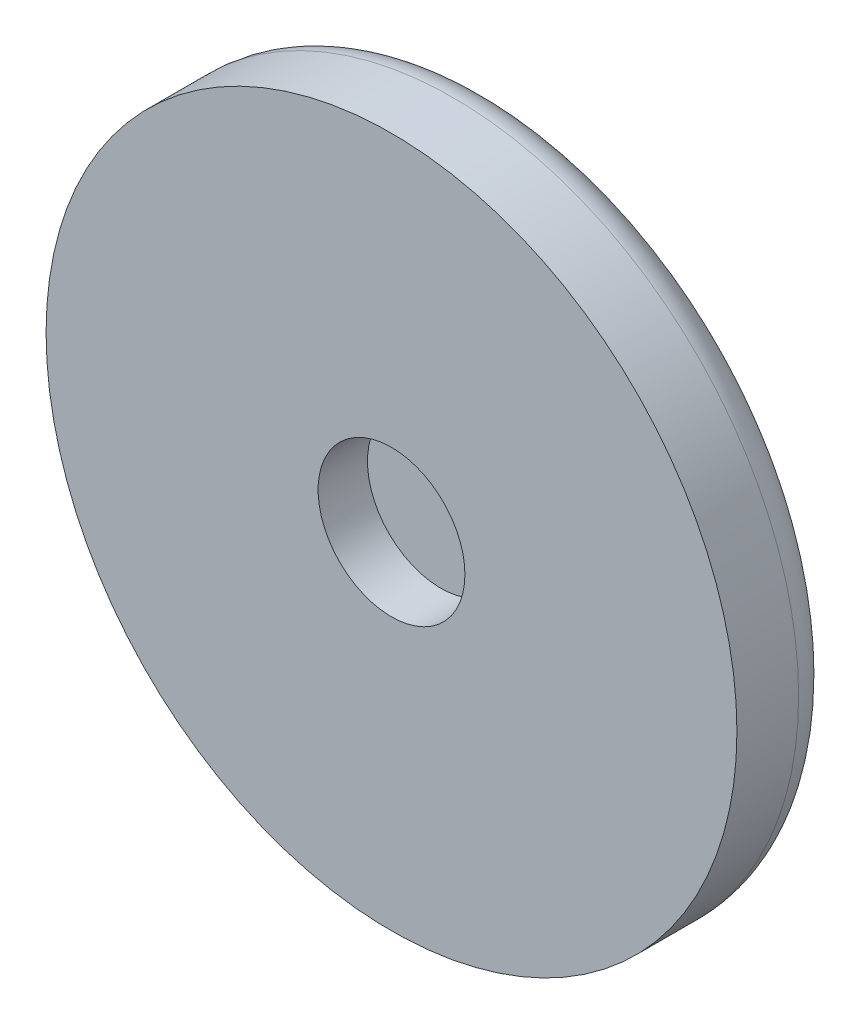
ISO-10303-21;
HEADER;
FILE_DESCRIPTION(('STEP AP214'),'2;1');
FILE_NAME('part.step','',(''),(''),'','','');
FILE_SCHEMA(('AUTOMOTIVE_DESIGN { 1 0 10303 214 1 1 1 1 }'));
ENDSEC;
DATA;
#1=APPLICATION_CONTEXT('core data for automotive mechanical design processes');
#2=APPLICATION_PROTOCOL_DEFINITION('international standard','automotive_design',2000,#1);
#3=PRODUCT_CONTEXT('',#1,'mechanical');
#4=PRODUCT('Part','Part','',(#3));
#5=PRODUCT_RELATED_PRODUCT_CATEGORY('part','',(#4));
#6=PRODUCT_DEFINITION_FORMATION('','',#4);
#7=PRODUCT_DEFINITION_CONTEXT('part definition',#1,'design');
#8=PRODUCT_DEFINITION('design','',#6,#7);
#9=PRODUCT_DEFINITION_SHAPE('','',#8);
#10=(LENGTH_UNIT() NAMED_UNIT(*) SI_UNIT(.MILLI.,.METRE.));
#11=(NAMED_UNIT(*) PLANE_ANGLE_UNIT() SI_UNIT($,.RADIAN.));
#12=(NAMED_UNIT(*) SI_UNIT($,.STERADIAN.) SOLID_ANGLE_UNIT());
#13=UNCERTAINTY_MEASURE_WITH_UNIT(LENGTH_MEASURE(1.E-05),#10,'distance_accuracy_value','');
#14=(GEOMETRIC_REPRESENTATION_CONTEXT(3) GLOBAL_UNCERTAINTY_ASSIGNED_CONTEXT((#13)) GLOBAL_UNIT_ASSIGNED_CONTEXT((#10,
#11,#12)) REPRESENTATION_CONTEXT('',''));
#15=CARTESIAN_POINT('',(0.,0.,0.));
#16=DIRECTION('',(0.,0.,1.));
#17=DIRECTION('',(1.,0.,0.));
#18=AXIS2_PLACEMENT_3D('',#15,#16,#17);
#19=CARTESIAN_POINT('',(0.,0.,4.));
#20=DIRECTION('',(0.,0.,-1.));
#21=DIRECTION('',(-1.,0.,0.));
#22=AXIS2_PLACEMENT_3D('',#19,#20,#21);
#23=CYLINDRICAL_SURFACE('',#22,14.);
#24=CARTESIAN_POINT('',(0.,0.,1.5));
#25=DIRECTION('',(0.,0.,1.));
#26=DIRECTION('',(1.,0.,0.));
#27=AXIS2_PLACEMENT_3D('',#24,#25,#26);
#28=CIRCLE('',#27,14.);
#29=CARTESIAN_POINT('',(14.,0.,1.5));
#30=VERTEX_POINT('',#29);
#31=EDGE_CURVE('E38',#30,#30,#28,.T.);
#32=ORIENTED_EDGE('',*,*,#31,.T.);
#33=EDGE_LOOP('',(#32));
#34=FACE_BOUND('',#33,.T.);
#35=CARTESIAN_POINT('',(0.,0.,4.));
#36=DIRECTION('',(0.,0.,1.));
#37=DIRECTION('',(1.,0.,0.));
#38=AXIS2_PLACEMENT_3D('',#35,#36,#37);
#39=CIRCLE('',#38,14.);
#40=CARTESIAN_POINT('',(14.,0.,4.));
#41=VERTEX_POINT('',#40);
#42=EDGE_CURVE('E55',#41,#41,#39,.T.);
#43=ORIENTED_EDGE('',*,*,#42,.F.);
#44=EDGE_LOOP('',(#43));
#45=FACE_BOUND('',#44,.T.);
#46=ADVANCED_FACE('F31',(#34,#45),#23,.T.);
#47=CARTESIAN_POINT('',(0.,0.,4.));
#48=DIRECTION('',(0.,0.,1.));
#49=DIRECTION('',(1.,0.,0.));
#50=AXIS2_PLACEMENT_3D('',#47,#48,#49);
#51=PLANE('',#50);
#52=CARTESIAN_POINT('',(0.,0.,4.));
#53=DIRECTION('',(0.,0.,1.));
#54=DIRECTION('',(1.,0.,0.));
#55=AXIS2_PLACEMENT_3D('',#52,#53,#54);
#56=CIRCLE('',#55,2.975);
#57=CARTESIAN_POINT('',(2.975,0.,4.));
#58=VERTEX_POINT('',#57);
#59=EDGE_CURVE('E51',#58,#58,#56,.T.);
#60=ORIENTED_EDGE('',*,*,#59,.F.);
#61=EDGE_LOOP('',(#60));
#62=FACE_BOUND('',#61,.T.);
#63=ORIENTED_EDGE('',*,*,#42,.T.);
#64=EDGE_LOOP('',(#63));
#65=FACE_BOUND('',#64,.T.);
#66=ADVANCED_FACE('F73',(#62,#65),#51,.T.);
#67=CARTESIAN_POINT('',(0.,0.,0.));
#68=DIRECTION('',(0.,0.,1.));
#69=DIRECTION('',(1.,0.,0.));
#70=AXIS2_PLACEMENT_3D('',#67,#68,#69);
#71=PLANE('',#70);
#72=CARTESIAN_POINT('',(0.,0.,0.));
#73=DIRECTION('',(0.,0.,1.));
#74=DIRECTION('',(1.,0.,0.));
#75=AXIS2_PLACEMENT_3D('',#72,#73,#74);
#76=CIRCLE('',#75,12.5);
#77=CARTESIAN_POINT('',(12.5,0.,0.));
#78=VERTEX_POINT('',#77);
#79=EDGE_CURVE('E10',#78,#78,#76,.F.);
#80=ORIENTED_EDGE('',*,*,#79,.T.);
#81=EDGE_LOOP('',(#80));
#82=FACE_BOUND('',#81,.T.);
#83=CARTESIAN_POINT('',(0.,0.,0.));
#84=DIRECTION('',(0.,0.,1.));
#85=DIRECTION('',(1.,0.,0.));
#86=AXIS2_PLACEMENT_3D('',#83,#84,#85);
#87=CIRCLE('',#86,11.5);
#88=CARTESIAN_POINT('',(11.5,0.,0.));
#89=VERTEX_POINT('',#88);
#90=EDGE_CURVE('E42',#89,#89,#87,.T.);
#91=ORIENTED_EDGE('',*,*,#90,.T.);
#92=EDGE_LOOP('',(#91));
#93=FACE_BOUND('',#92,.T.);
#94=ADVANCED_FACE('F69',(#82,#93),#71,.F.);
#95=CARTESIAN_POINT('',(0.,0.,2.));
#96=DIRECTION('',(0.,0.,1.));
#97=DIRECTION('',(1.,0.,0.));
#98=AXIS2_PLACEMENT_3D('',#95,#96,#97);
#99=CYLINDRICAL_SURFACE('',#98,2.975);
#100=CARTESIAN_POINT('',(0.,0.,2.));
#101=DIRECTION('',(0.,0.,1.));
#102=DIRECTION('',(1.,0.,0.));
#103=AXIS2_PLACEMENT_3D('',#100,#101,#102);
#104=CIRCLE('',#103,2.975);
#105=CARTESIAN_POINT('',(2.975,0.,2.));
#106=VERTEX_POINT('',#105);
#107=EDGE_CURVE('E58',#106,#106,#104,.T.);
#108=ORIENTED_EDGE('',*,*,#107,.F.);
#109=EDGE_LOOP('',(#108));
#110=FACE_BOUND('',#109,.T.);
#111=ORIENTED_EDGE('',*,*,#59,.T.);
#112=EDGE_LOOP('',(#111));
#113=FACE_BOUND('',#112,.T.);
#114=ADVANCED_FACE('F66',(#110,#113),#99,.F.);
#115=CARTESIAN_POINT('',(0.,0.,2.));
#116=DIRECTION('',(0.,0.,1.));
#117=DIRECTION('',(1.,0.,0.));
#118=AXIS2_PLACEMENT_3D('',#115,#116,#117);
#119=PLANE('',#118);
#120=ORIENTED_EDGE('',*,*,#107,.T.);
#121=EDGE_LOOP('',(#120));
#122=FACE_BOUND('',#121,.T.);
#123=ADVANCED_FACE('F64',(#122),#119,.T.);
#124=CARTESIAN_POINT('',(0.,0.,1.));
#125=DIRECTION('',(0.,0.,-1.));
#126=DIRECTION('',(-1.,0.,0.));
#127=AXIS2_PLACEMENT_3D('',#124,#125,#126);
#128=PLANE('',#127);
#129=CARTESIAN_POINT('',(0.,0.,1.));
#130=DIRECTION('',(0.,0.,-1.));
#131=DIRECTION('',(-1.,0.,0.));
#132=AXIS2_PLACEMENT_3D('',#129,#130,#131);
#133=CIRCLE('',#132,10.5);
#134=CARTESIAN_POINT('',(-10.5,0.,1.));
#135=VERTEX_POINT('',#134);
#136=EDGE_CURVE('E46',#135,#135,#133,.T.);
#137=ORIENTED_EDGE('',*,*,#136,.T.);
#138=EDGE_LOOP('',(#137));
#139=FACE_BOUND('',#138,.T.);
#140=ADVANCED_FACE('F90',(#139),#128,.T.);
#141=CARTESIAN_POINT('',(0.,0.,0.5));
#142=DIRECTION('',(0.,0.,1.));
#143=DIRECTION('',(1.,0.,0.));
#144=AXIS2_PLACEMENT_3D('',#141,#142,#143);
#145=TOROIDAL_SURFACE('',#144,11.5,0.5);
#146=ORIENTED_EDGE('',*,*,#90,.F.);
#147=EDGE_LOOP('',(#146));
#148=FACE_BOUND('',#147,.T.);
#149=CARTESIAN_POINT('',(0.,0.,0.5));
#150=DIRECTION('',(0.,0.,1.));
#151=DIRECTION('',(1.,0.,0.));
#152=AXIS2_PLACEMENT_3D('',#149,#150,#151);
#153=CIRCLE('',#152,11.);
#154=CARTESIAN_POINT('',(11.,0.,0.5));
#155=VERTEX_POINT('',#154);
#156=EDGE_CURVE('E49',#155,#155,#153,.F.);
#157=ORIENTED_EDGE('',*,*,#156,.F.);
#158=EDGE_LOOP('',(#157));
#159=FACE_BOUND('',#158,.T.);
#160=ADVANCED_FACE('F87',(#148,#159),#145,.T.);
#161=CARTESIAN_POINT('',(0.,0.,0.5));
#162=DIRECTION('',(0.,0.,-1.));
#163=DIRECTION('',(-1.,0.,0.));
#164=AXIS2_PLACEMENT_3D('',#161,#162,#163);
#165=TOROIDAL_SURFACE('',#164,10.5,0.5);
#166=ORIENTED_EDGE('',*,*,#156,.T.);
#167=EDGE_LOOP('',(#166));
#168=FACE_BOUND('',#167,.T.);
#169=ORIENTED_EDGE('',*,*,#136,.F.);
#170=EDGE_LOOP('',(#169));
#171=FACE_BOUND('',#170,.T.);
#172=ADVANCED_FACE('F85',(#168,#171),#165,.F.);
#173=CARTESIAN_POINT('',(0.,0.,1.5));
#174=DIRECTION('',(0.,0.,1.));
#175=DIRECTION('',(1.,0.,0.));
#176=AXIS2_PLACEMENT_3D('',#173,#174,#175);
#177=TOROIDAL_SURFACE('',#176,12.5,1.5);
#178=ORIENTED_EDGE('',*,*,#79,.F.);
#179=EDGE_LOOP('',(#178));
#180=FACE_BOUND('',#179,.T.);
#181=ORIENTED_EDGE('',*,*,#31,.F.);
#182=EDGE_LOOP('',(#181));
#183=FACE_BOUND('',#182,.T.);
#184=ADVANCED_FACE('F33',(#180,#183),#177,.T.);
#185=CLOSED_SHELL('',(#46,#66,#94,#114,#123,#140,#160,#172,#184));
#186=MANIFOLD_SOLID_BREP('B2',#185);
#187=ADVANCED_BREP_SHAPE_REPRESENTATION('',(#18,#186),#14);
#188=SHAPE_DEFINITION_REPRESENTATION(#9,#187);
ENDSEC;
END-ISO-10303-21;
